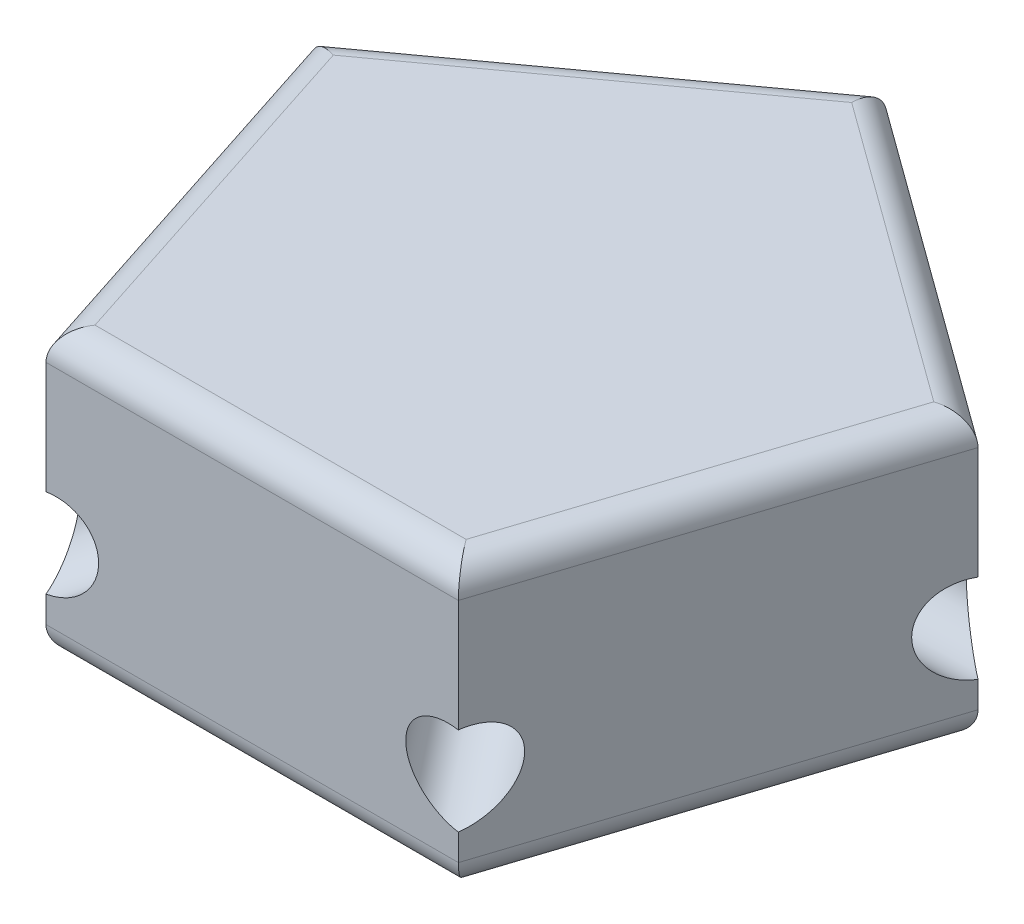
ISO-10303-21;
HEADER;
FILE_DESCRIPTION(('STEP AP214'),'2;1');
FILE_NAME('part.step','',(''),(''),'','','');
FILE_SCHEMA(('AUTOMOTIVE_DESIGN { 1 0 10303 214 1 1 1 1 }'));
ENDSEC;
DATA;
#1=APPLICATION_CONTEXT('core data for automotive mechanical design processes');
#2=APPLICATION_PROTOCOL_DEFINITION('international standard','automotive_design',2000,#1);
#3=PRODUCT_CONTEXT('',#1,'mechanical');
#4=PRODUCT('Part','Part','',(#3));
#5=PRODUCT_RELATED_PRODUCT_CATEGORY('part','',(#4));
#6=PRODUCT_DEFINITION_FORMATION('','',#4);
#7=PRODUCT_DEFINITION_CONTEXT('part definition',#1,'design');
#8=PRODUCT_DEFINITION('design','',#6,#7);
#9=PRODUCT_DEFINITION_SHAPE('','',#8);
#10=(LENGTH_UNIT() NAMED_UNIT(*) SI_UNIT(.MILLI.,.METRE.));
#11=(NAMED_UNIT(*) PLANE_ANGLE_UNIT() SI_UNIT($,.RADIAN.));
#12=(NAMED_UNIT(*) SI_UNIT($,.STERADIAN.) SOLID_ANGLE_UNIT());
#13=UNCERTAINTY_MEASURE_WITH_UNIT(LENGTH_MEASURE(1.E-05),#10,'distance_accuracy_value','');
#14=(GEOMETRIC_REPRESENTATION_CONTEXT(3) GLOBAL_UNCERTAINTY_ASSIGNED_CONTEXT((#13)) GLOBAL_UNIT_ASSIGNED_CONTEXT((#10,
#11,#12)) REPRESENTATION_CONTEXT('',''));
#15=CARTESIAN_POINT('',(0.,0.,0.));
#16=DIRECTION('',(0.,0.,1.));
#17=DIRECTION('',(1.,0.,0.));
#18=AXIS2_PLACEMENT_3D('',#15,#16,#17);
#19=CARTESIAN_POINT('',(-11.7557050458495,-7.,-3.81966011250105));
#20=DIRECTION('',(-0.951056516295154,0.,0.309016994374947));
#21=DIRECTION('',(0.309016994374947,0.,0.951056516295154));
#22=AXIS2_PLACEMENT_3D('',#19,#20,#21);
#23=PLANE('',#22);
#24=CARTESIAN_POINT('',(-11.7557050458491,-3.51141009169856,-3.81966011249993));
#25=DIRECTION('',(-0.951056516295154,0.,0.309016994374947));
#26=DIRECTION('',(0.278226309960892,0.435147350957825,0.856292533775656));
#27=AXIS2_PLACEMENT_3D('',#24,#25,#26);
#28=ELLIPSE('',#27,1.92746442768023,1.49999999999998);
#29=CARTESIAN_POINT('',(-11.7557050458495,-5.07076156974525,-3.81966011250105));
#30=VERTEX_POINT('',#29);
#31=CARTESIAN_POINT('',(-11.7557050458495,-1.95205861365226,-3.81966011250105));
#32=VERTEX_POINT('',#31);
#33=EDGE_CURVE('E46',#30,#32,#28,.T.);
#34=ORIENTED_EDGE('',*,*,#33,.F.);
#35=DIRECTION('',(0.,1.,0.));
#36=VECTOR('',#35,1.);
#37=CARTESIAN_POINT('',(-11.7557050458495,-7.,-3.81966011250105));
#38=LINE('',#37,#36);
#39=CARTESIAN_POINT('',(-11.7557050458495,-6.,-3.81966011250105));
#40=VERTEX_POINT('',#39);
#41=EDGE_CURVE('E177',#40,#30,#38,.T.);
#42=ORIENTED_EDGE('',*,*,#41,.F.);
#43=DIRECTION('',(0.309016994374947,0.,0.951056516295154));
#44=VECTOR('',#43,1.);
#45=CARTESIAN_POINT('',(-7.26542528005361,-6.,10.));
#46=LINE('',#45,#44);
#47=CARTESIAN_POINT('',(-7.26542528005361,-6.,10.));
#48=VERTEX_POINT('',#47);
#49=EDGE_CURVE('E207',#40,#48,#46,.T.);
#50=ORIENTED_EDGE('',*,*,#49,.T.);
#51=DIRECTION('',(0.,1.,0.));
#52=VECTOR('',#51,1.);
#53=CARTESIAN_POINT('',(-7.26542528005361,-7.,10.));
#54=LINE('',#53,#52);
#55=CARTESIAN_POINT('',(-7.26542528005361,-5.07076156974525,10.));
#56=VERTEX_POINT('',#55);
#57=EDGE_CURVE('E168',#48,#56,#54,.T.);
#58=ORIENTED_EDGE('',*,*,#57,.T.);
#59=CARTESIAN_POINT('',(-7.26542528005323,-3.51141009169896,10.0000000000012));
#60=DIRECTION('',(-0.951056516295154,0.,0.309016994374947));
#61=DIRECTION('',(-0.278226309960893,0.435147350957815,-0.856292533775661));
#62=AXIS2_PLACEMENT_3D('',#59,#60,#61);
#63=ELLIPSE('',#62,1.92746442768026,1.49999999999998);
#64=CARTESIAN_POINT('',(-7.26542528005361,-1.95205861365226,10.));
#65=VERTEX_POINT('',#64);
#66=EDGE_CURVE('E237',#65,#56,#63,.T.);
#67=ORIENTED_EDGE('',*,*,#66,.F.);
#68=CARTESIAN_POINT('',(-7.26542528005361,2.,10.));
#69=VERTEX_POINT('',#68);
#70=EDGE_CURVE('E173',#65,#69,#54,.T.);
#71=ORIENTED_EDGE('',*,*,#70,.T.);
#72=DIRECTION('',(0.309016994374947,0.,0.951056516295154));
#73=VECTOR('',#72,1.);
#74=CARTESIAN_POINT('',(-11.7557050458495,2.,-3.81966011250105));
#75=LINE('',#74,#73);
#76=CARTESIAN_POINT('',(-11.7557050458495,2.,-3.81966011250105));
#77=VERTEX_POINT('',#76);
#78=EDGE_CURVE('E204',#69,#77,#75,.F.);
#79=ORIENTED_EDGE('',*,*,#78,.T.);
#80=EDGE_CURVE('E264',#32,#77,#38,.T.);
#81=ORIENTED_EDGE('',*,*,#80,.F.);
#82=EDGE_LOOP('',(#34,#42,#50,#58,#67,#71,#79,#81));
#83=FACE_BOUND('',#82,.T.);
#84=ADVANCED_FACE('F33',(#83),#23,.T.);
#85=CARTESIAN_POINT('',(0.,-7.,-12.3606797749979));
#86=DIRECTION('',(-0.587785252292473,0.,-0.809016994374947));
#87=DIRECTION('',(-0.809016994374947,0.,0.587785252292473));
#88=AXIS2_PLACEMENT_3D('',#85,#86,#87);
#89=PLANE('',#88);
#90=CARTESIAN_POINT('',(-11.7557050458504,-3.51141009169895,-3.81966011250036));
#91=DIRECTION('',(-0.587785252292473,0.,-0.809016994374947));
#92=DIRECTION('',(0.728405936042082,0.435147350957816,-0.529217890186125));
#93=AXIS2_PLACEMENT_3D('',#90,#91,#92);
#94=ELLIPSE('',#93,1.92746442768025,1.49999999999998);
#95=EDGE_CURVE('E11',#32,#30,#94,.T.);
#96=ORIENTED_EDGE('',*,*,#95,.F.);
#97=ORIENTED_EDGE('',*,*,#80,.T.);
#98=DIRECTION('',(-0.809016994374947,0.,0.587785252292473));
#99=VECTOR('',#98,1.);
#100=CARTESIAN_POINT('',(0.,2.,-12.3606797749979));
#101=LINE('',#100,#99);
#102=CARTESIAN_POINT('',(0.,2.,-12.3606797749979));
#103=VERTEX_POINT('',#102);
#104=EDGE_CURVE('E199',#77,#103,#101,.F.);
#105=ORIENTED_EDGE('',*,*,#104,.T.);
#106=DIRECTION('',(0.,1.,0.));
#107=VECTOR('',#106,1.);
#108=CARTESIAN_POINT('',(0.,-7.,-12.3606797749979));
#109=LINE('',#108,#107);
#110=CARTESIAN_POINT('',(0.,-1.95205861365226,-12.3606797749979));
#111=VERTEX_POINT('',#110);
#112=EDGE_CURVE('E259',#111,#103,#109,.T.);
#113=ORIENTED_EDGE('',*,*,#112,.F.);
#114=CARTESIAN_POINT('',(-9.16789166848286E-13,-3.51141009169856,-12.3606797749972));
#115=DIRECTION('',(-0.587785252292473,0.,-0.809016994374947));
#116=DIRECTION('',(-0.728405936042079,0.435147350957823,0.529217890186123));
#117=AXIS2_PLACEMENT_3D('',#114,#115,#116);
#118=ELLIPSE('',#117,1.92746442768023,1.49999999999998);
#119=CARTESIAN_POINT('',(0.,-5.07076156974525,-12.3606797749979));
#120=VERTEX_POINT('',#119);
#121=EDGE_CURVE('E53',#120,#111,#118,.T.);
#122=ORIENTED_EDGE('',*,*,#121,.F.);
#123=CARTESIAN_POINT('',(0.,-6.,-12.3606797749979));
#124=VERTEX_POINT('',#123);
#125=EDGE_CURVE('E257',#124,#120,#109,.T.);
#126=ORIENTED_EDGE('',*,*,#125,.F.);
#127=DIRECTION('',(-0.809016994374947,0.,0.587785252292473));
#128=VECTOR('',#127,1.);
#129=CARTESIAN_POINT('',(-11.7557050458495,-6.,-3.81966011250105));
#130=LINE('',#129,#128);
#131=EDGE_CURVE('E202',#124,#40,#130,.T.);
#132=ORIENTED_EDGE('',*,*,#131,.T.);
#133=ORIENTED_EDGE('',*,*,#41,.T.);
#134=EDGE_LOOP('',(#96,#97,#105,#113,#122,#126,#132,#133));
#135=FACE_BOUND('',#134,.T.);
#136=ADVANCED_FACE('F256',(#135),#89,.T.);
#137=CARTESIAN_POINT('',(11.7557050458495,-7.,-3.81966011250106));
#138=DIRECTION('',(0.587785252292473,0.,-0.809016994374947));
#139=DIRECTION('',(-0.809016994374948,0.,-0.587785252292473));
#140=AXIS2_PLACEMENT_3D('',#137,#138,#139);
#141=PLANE('',#140);
#142=CARTESIAN_POINT('',(-9.16789166848295E-13,-3.51141009169894,-12.3606797749986));
#143=DIRECTION('',(0.587785252292473,0.,-0.809016994374947));
#144=DIRECTION('',(0.728405936042081,0.435147350957817,0.529217890186125));
#145=AXIS2_PLACEMENT_3D('',#142,#143,#144);
#146=ELLIPSE('',#145,1.92746442768025,1.49999999999998);
#147=EDGE_CURVE('E41',#111,#120,#146,.T.);
#148=ORIENTED_EDGE('',*,*,#147,.F.);
#149=ORIENTED_EDGE('',*,*,#112,.T.);
#150=DIRECTION('',(-0.809016994374948,0.,-0.587785252292473));
#151=VECTOR('',#150,1.);
#152=CARTESIAN_POINT('',(11.7557050458495,2.,-3.81966011250106));
#153=LINE('',#152,#151);
#154=CARTESIAN_POINT('',(11.7557050458495,2.,-3.81966011250106));
#155=VERTEX_POINT('',#154);
#156=EDGE_CURVE('E194',#103,#155,#153,.F.);
#157=ORIENTED_EDGE('',*,*,#156,.T.);
#158=DIRECTION('',(0.,1.,0.));
#159=VECTOR('',#158,1.);
#160=CARTESIAN_POINT('',(11.7557050458495,-7.,-3.81966011250106));
#161=LINE('',#160,#159);
#162=CARTESIAN_POINT('',(11.7557050458495,-1.95205861365226,-3.81966011250106));
#163=VERTEX_POINT('',#162);
#164=EDGE_CURVE('E164',#163,#155,#161,.T.);
#165=ORIENTED_EDGE('',*,*,#164,.F.);
#166=CARTESIAN_POINT('',(11.7557050458486,-3.51141009169858,-3.81966011250169));
#167=DIRECTION('',(0.587785252292473,0.,-0.809016994374947));
#168=DIRECTION('',(-0.72840593604208,0.435147350957822,-0.529217890186124));
#169=AXIS2_PLACEMENT_3D('',#166,#167,#168);
#170=ELLIPSE('',#169,1.92746442768024,1.49999999999998);
#171=CARTESIAN_POINT('',(11.7557050458495,-5.07076156974525,-3.81966011250106));
#172=VERTEX_POINT('',#171);
#173=EDGE_CURVE('E156',#172,#163,#170,.T.);
#174=ORIENTED_EDGE('',*,*,#173,.F.);
#175=CARTESIAN_POINT('',(11.7557050458495,-6.,-3.81966011250106));
#176=VERTEX_POINT('',#175);
#177=EDGE_CURVE('E166',#176,#172,#161,.T.);
#178=ORIENTED_EDGE('',*,*,#177,.F.);
#179=DIRECTION('',(-0.809016994374948,0.,-0.587785252292473));
#180=VECTOR('',#179,1.);
#181=CARTESIAN_POINT('',(0.,-6.,-12.3606797749979));
#182=LINE('',#181,#180);
#183=EDGE_CURVE('E197',#176,#124,#182,.T.);
#184=ORIENTED_EDGE('',*,*,#183,.T.);
#185=ORIENTED_EDGE('',*,*,#125,.T.);
#186=EDGE_LOOP('',(#148,#149,#157,#165,#174,#178,#184,#185));
#187=FACE_BOUND('',#186,.T.);
#188=ADVANCED_FACE('F261',(#187),#141,.T.);
#189=CARTESIAN_POINT('',(7.26542528005361,-7.,10.));
#190=DIRECTION('',(0.951056516295154,0.,0.309016994374947));
#191=DIRECTION('',(0.309016994374948,0.,-0.951056516295154));
#192=AXIS2_PLACEMENT_3D('',#189,#190,#191);
#193=PLANE('',#192);
#194=CARTESIAN_POINT('',(11.7557050458498,-3.51141009169894,-3.81966011250208));
#195=DIRECTION('',(0.951056516295154,0.,0.309016994374947));
#196=DIRECTION('',(-0.278226309960893,0.435147350957819,0.856292533775659));
#197=AXIS2_PLACEMENT_3D('',#194,#195,#196);
#198=ELLIPSE('',#197,1.92746442768025,1.49999999999998);
#199=EDGE_CURVE('E146',#163,#172,#198,.T.);
#200=ORIENTED_EDGE('',*,*,#199,.F.);
#201=ORIENTED_EDGE('',*,*,#164,.T.);
#202=DIRECTION('',(0.309016994374948,0.,-0.951056516295154));
#203=VECTOR('',#202,1.);
#204=CARTESIAN_POINT('',(7.26542528005361,2.,10.));
#205=LINE('',#204,#203);
#206=CARTESIAN_POINT('',(7.26542528005361,2.,10.));
#207=VERTEX_POINT('',#206);
#208=EDGE_CURVE('E190',#155,#207,#205,.F.);
#209=ORIENTED_EDGE('',*,*,#208,.T.);
#210=DIRECTION('',(0.,1.,0.));
#211=VECTOR('',#210,1.);
#212=CARTESIAN_POINT('',(7.26542528005361,-7.,10.));
#213=LINE('',#212,#211);
#214=CARTESIAN_POINT('',(7.26542528005361,-1.95205861365226,10.));
#215=VERTEX_POINT('',#214);
#216=EDGE_CURVE('E155',#215,#207,#213,.T.);
#217=ORIENTED_EDGE('',*,*,#216,.F.);
#218=CARTESIAN_POINT('',(7.26542528005393,-3.51141009169858,9.99999999999901));
#219=DIRECTION('',(0.951056516295154,0.,0.309016994374947));
#220=DIRECTION('',(0.278226309960893,0.435147350957821,-0.856292533775658));
#221=AXIS2_PLACEMENT_3D('',#218,#219,#220);
#222=ELLIPSE('',#221,1.92746442768024,1.49999999999998);
#223=CARTESIAN_POINT('',(7.26542528005361,-5.07076156974525,10.));
#224=VERTEX_POINT('',#223);
#225=EDGE_CURVE('E142',#224,#215,#222,.T.);
#226=ORIENTED_EDGE('',*,*,#225,.F.);
#227=CARTESIAN_POINT('',(7.26542528005361,-6.,10.));
#228=VERTEX_POINT('',#227);
#229=EDGE_CURVE('E153',#228,#224,#213,.T.);
#230=ORIENTED_EDGE('',*,*,#229,.F.);
#231=DIRECTION('',(0.309016994374948,0.,-0.951056516295154));
#232=VECTOR('',#231,1.);
#233=CARTESIAN_POINT('',(11.7557050458495,-6.,-3.81966011250106));
#234=LINE('',#233,#232);
#235=EDGE_CURVE('E192',#228,#176,#234,.T.);
#236=ORIENTED_EDGE('',*,*,#235,.T.);
#237=ORIENTED_EDGE('',*,*,#177,.T.);
#238=EDGE_LOOP('',(#200,#201,#209,#217,#226,#230,#236,#237));
#239=FACE_BOUND('',#238,.T.);
#240=ADVANCED_FACE('F152',(#239),#193,.T.);
#241=CARTESIAN_POINT('',(-7.26542528005361,-7.,10.));
#242=DIRECTION('',(0.,0.,1.));
#243=DIRECTION('',(1.,0.,0.));
#244=AXIS2_PLACEMENT_3D('',#241,#242,#243);
#245=PLANE('',#244);
#246=CARTESIAN_POINT('',(7.26542528005466,-3.51141009169893,10.));
#247=DIRECTION('',(0.,0.,1.));
#248=DIRECTION('',(-0.900359252162375,0.43514735095782,0.));
#249=AXIS2_PLACEMENT_3D('',#246,#247,#248);
#250=ELLIPSE('',#249,1.92746442768024,1.49999999999998);
#251=EDGE_CURVE('E138',#215,#224,#250,.T.);
#252=ORIENTED_EDGE('',*,*,#251,.F.);
#253=ORIENTED_EDGE('',*,*,#216,.T.);
#254=DIRECTION('',(1.,0.,0.));
#255=VECTOR('',#254,1.);
#256=CARTESIAN_POINT('',(-7.26542528005361,2.,10.));
#257=LINE('',#256,#255);
#258=EDGE_CURVE('E174',#207,#69,#257,.F.);
#259=ORIENTED_EDGE('',*,*,#258,.T.);
#260=ORIENTED_EDGE('',*,*,#70,.F.);
#261=CARTESIAN_POINT('',(-7.26542528005239,-3.51141009169855,10.));
#262=DIRECTION('',(0.,0.,1.));
#263=DIRECTION('',(0.900359252162372,0.435147350957826,0.));
#264=AXIS2_PLACEMENT_3D('',#261,#262,#263);
#265=ELLIPSE('',#264,1.92746442768022,1.49999999999998);
#266=EDGE_CURVE('E147',#56,#65,#265,.T.);
#267=ORIENTED_EDGE('',*,*,#266,.F.);
#268=ORIENTED_EDGE('',*,*,#57,.F.);
#269=DIRECTION('',(1.,0.,0.));
#270=VECTOR('',#269,1.);
#271=CARTESIAN_POINT('',(7.26542528005361,-6.,10.));
#272=LINE('',#271,#270);
#273=EDGE_CURVE('E163',#48,#228,#272,.T.);
#274=ORIENTED_EDGE('',*,*,#273,.T.);
#275=ORIENTED_EDGE('',*,*,#229,.T.);
#276=EDGE_LOOP('',(#252,#253,#259,#260,#267,#268,#274,#275));
#277=FACE_BOUND('',#276,.T.);
#278=ADVANCED_FACE('F160',(#277),#245,.T.);
#279=CARTESIAN_POINT('',(0.,-7.,0.));
#280=DIRECTION('',(0.,1.,0.));
#281=DIRECTION('',(0.,0.,1.));
#282=AXIS2_PLACEMENT_3D('',#279,#280,#281);
#283=PLANE('',#282);
#284=DIRECTION('',(0.309016994374948,0.,-0.951056516295154));
#285=VECTOR('',#284,1.);
#286=CARTESIAN_POINT('',(6.31436876375846,-7.,9.69098300562505));
#287=LINE('',#286,#285);
#288=CARTESIAN_POINT('',(10.5801345412645,-7.,-3.43769410125095));
#289=VERTEX_POINT('',#288);
#290=CARTESIAN_POINT('',(6.53888275204825,-7.,9.));
#291=VERTEX_POINT('',#290);
#292=EDGE_CURVE('E185',#289,#291,#287,.F.);
#293=ORIENTED_EDGE('',*,*,#292,.T.);
#294=DIRECTION('',(1.,0.,0.));
#295=VECTOR('',#294,1.);
#296=CARTESIAN_POINT('',(-7.26542528005361,-7.,9.));
#297=LINE('',#296,#295);
#298=CARTESIAN_POINT('',(-6.53888275204825,-7.,9.));
#299=VERTEX_POINT('',#298);
#300=EDGE_CURVE('E187',#291,#299,#297,.F.);
#301=ORIENTED_EDGE('',*,*,#300,.T.);
#302=DIRECTION('',(0.309016994374947,0.,0.951056516295154));
#303=VECTOR('',#302,1.);
#304=CARTESIAN_POINT('',(-10.8046485295543,-7.,-4.128677106876));
#305=LINE('',#304,#303);
#306=CARTESIAN_POINT('',(-10.5801345412645,-7.,-3.43769410125095));
#307=VERTEX_POINT('',#306);
#308=EDGE_CURVE('E179',#299,#307,#305,.F.);
#309=ORIENTED_EDGE('',*,*,#308,.T.);
#310=DIRECTION('',(-0.809016994374947,0.,0.587785252292473));
#311=VECTOR('',#310,1.);
#312=CARTESIAN_POINT('',(0.587785252292473,-7.,-11.551662780623));
#313=LINE('',#312,#311);
#314=CARTESIAN_POINT('',(0.,-7.,-11.1246117974981));
#315=VERTEX_POINT('',#314);
#316=EDGE_CURVE('E181',#307,#315,#313,.F.);
#317=ORIENTED_EDGE('',*,*,#316,.T.);
#318=DIRECTION('',(-0.809016994374948,0.,-0.587785252292473));
#319=VECTOR('',#318,1.);
#320=CARTESIAN_POINT('',(11.167919793557,-7.,-3.01064311812611));
#321=LINE('',#320,#319);
#322=EDGE_CURVE('E183',#315,#289,#321,.F.);
#323=ORIENTED_EDGE('',*,*,#322,.T.);
#324=EDGE_LOOP('',(#293,#301,#309,#317,#323));
#325=FACE_BOUND('',#324,.T.);
#326=ADVANCED_FACE('F383',(#325),#283,.F.);
#327=CARTESIAN_POINT('',(0.,3.,0.));
#328=DIRECTION('',(0.,1.,0.));
#329=DIRECTION('',(0.,0.,1.));
#330=AXIS2_PLACEMENT_3D('',#327,#328,#329);
#331=PLANE('',#330);
#332=DIRECTION('',(-0.809016994374948,0.,-0.587785252292473));
#333=VECTOR('',#332,1.);
#334=CARTESIAN_POINT('',(5.29006727063226,3.,-7.28115294937453));
#335=LINE('',#334,#333);
#336=CARTESIAN_POINT('',(10.5801345412645,3.,-3.43769410125095));
#337=VERTEX_POINT('',#336);
#338=CARTESIAN_POINT('',(0.,3.,-11.1246117974981));
#339=VERTEX_POINT('',#338);
#340=EDGE_CURVE('E215',#337,#339,#335,.T.);
#341=ORIENTED_EDGE('',*,*,#340,.T.);
#342=DIRECTION('',(-0.809016994374947,0.,0.587785252292473));
#343=VECTOR('',#342,1.);
#344=CARTESIAN_POINT('',(-5.29006727063226,3.,-7.28115294937453));
#345=LINE('',#344,#343);
#346=CARTESIAN_POINT('',(-10.5801345412645,3.,-3.43769410125095));
#347=VERTEX_POINT('',#346);
#348=EDGE_CURVE('E217',#339,#347,#345,.T.);
#349=ORIENTED_EDGE('',*,*,#348,.T.);
#350=DIRECTION('',(0.309016994374947,0.,0.951056516295154));
#351=VECTOR('',#350,1.);
#352=CARTESIAN_POINT('',(-8.55950864665638,3.,2.78115294937453));
#353=LINE('',#352,#351);
#354=CARTESIAN_POINT('',(-6.53888275204825,3.,9.));
#355=VERTEX_POINT('',#354);
#356=EDGE_CURVE('E209',#347,#355,#353,.T.);
#357=ORIENTED_EDGE('',*,*,#356,.T.);
#358=DIRECTION('',(1.,0.,0.));
#359=VECTOR('',#358,1.);
#360=CARTESIAN_POINT('',(0.,3.,9.));
#361=LINE('',#360,#359);
#362=CARTESIAN_POINT('',(6.53888275204825,3.,9.));
#363=VERTEX_POINT('',#362);
#364=EDGE_CURVE('E211',#355,#363,#361,.T.);
#365=ORIENTED_EDGE('',*,*,#364,.T.);
#366=DIRECTION('',(0.309016994374948,0.,-0.951056516295154));
#367=VECTOR('',#366,1.);
#368=CARTESIAN_POINT('',(8.55950864665638,3.,2.78115294937453));
#369=LINE('',#368,#367);
#370=EDGE_CURVE('E213',#363,#337,#369,.T.);
#371=ORIENTED_EDGE('',*,*,#370,.T.);
#372=EDGE_LOOP('',(#341,#349,#357,#365,#371));
#373=FACE_BOUND('',#372,.T.);
#374=ADVANCED_FACE('F326',(#373),#331,.T.);
#375=CARTESIAN_POINT('',(0.587785252292473,-6.,-11.551662780623));
#376=DIRECTION('',(0.809016994374947,0.,-0.587785252292473));
#377=DIRECTION('',(-0.587785252292473,0.,-0.809016994374947));
#378=AXIS2_PLACEMENT_3D('',#375,#376,#377);
#379=CYLINDRICAL_SURFACE('',#378,1.);
#380=CARTESIAN_POINT('',(-10.5801345412645,-6.,-3.43769410125094));
#381=DIRECTION('',(0.309016994374947,0.,-0.951056516295154));
#382=DIRECTION('',(-0.951056516295153,0.,-0.309016994374947));
#383=AXIS2_PLACEMENT_3D('',#380,#381,#382);
#384=ELLIPSE('',#383,1.23606797749979,1.);
#385=EDGE_CURVE('E228',#40,#307,#384,.F.);
#386=ORIENTED_EDGE('',*,*,#385,.F.);
#387=ORIENTED_EDGE('',*,*,#131,.F.);
#388=CARTESIAN_POINT('',(0.,-6.,-11.1246117974981));
#389=DIRECTION('',(1.,0.,0.));
#390=DIRECTION('',(0.,0.,-1.));
#391=AXIS2_PLACEMENT_3D('',#388,#389,#390);
#392=ELLIPSE('',#391,1.23606797749979,1.);
#393=EDGE_CURVE('E231',#315,#124,#392,.T.);
#394=ORIENTED_EDGE('',*,*,#393,.F.);
#395=ORIENTED_EDGE('',*,*,#316,.F.);
#396=EDGE_LOOP('',(#386,#387,#394,#395));
#397=FACE_BOUND('',#396,.T.);
#398=ADVANCED_FACE('F322',(#397),#379,.T.);
#399=CARTESIAN_POINT('',(11.167919793557,-6.,-3.01064311812611));
#400=DIRECTION('',(0.809016994374948,0.,0.587785252292473));
#401=DIRECTION('',(0.587785252292473,0.,-0.809016994374947));
#402=AXIS2_PLACEMENT_3D('',#399,#400,#401);
#403=CYLINDRICAL_SURFACE('',#402,1.);
#404=ORIENTED_EDGE('',*,*,#393,.T.);
#405=ORIENTED_EDGE('',*,*,#183,.F.);
#406=CARTESIAN_POINT('',(10.5801345412645,-6.,-3.43769410125095));
#407=DIRECTION('',(0.309016994374948,0.,0.951056516295154));
#408=DIRECTION('',(0.951056516295153,0.,-0.309016994374947));
#409=AXIS2_PLACEMENT_3D('',#406,#407,#408);
#410=ELLIPSE('',#409,1.23606797749979,1.);
#411=EDGE_CURVE('E225',#289,#176,#410,.T.);
#412=ORIENTED_EDGE('',*,*,#411,.F.);
#413=ORIENTED_EDGE('',*,*,#322,.F.);
#414=EDGE_LOOP('',(#404,#405,#412,#413));
#415=FACE_BOUND('',#414,.T.);
#416=ADVANCED_FACE('F318',(#415),#403,.T.);
#417=CARTESIAN_POINT('',(-10.8046485295543,-6.,-4.128677106876));
#418=DIRECTION('',(-0.309016994374947,0.,-0.951056516295154));
#419=DIRECTION('',(-0.951056516295154,0.,0.309016994374947));
#420=AXIS2_PLACEMENT_3D('',#417,#418,#419);
#421=CYLINDRICAL_SURFACE('',#420,1.);
#422=ORIENTED_EDGE('',*,*,#385,.T.);
#423=ORIENTED_EDGE('',*,*,#308,.F.);
#424=CARTESIAN_POINT('',(-6.53888275204825,-6.,9.));
#425=DIRECTION('',(-0.809016994374947,0.,-0.587785252292473));
#426=DIRECTION('',(0.587785252292473,0.,-0.809016994374947));
#427=AXIS2_PLACEMENT_3D('',#424,#425,#426);
#428=ELLIPSE('',#427,1.23606797749979,1.);
#429=EDGE_CURVE('E222',#48,#299,#428,.F.);
#430=ORIENTED_EDGE('',*,*,#429,.F.);
#431=ORIENTED_EDGE('',*,*,#49,.F.);
#432=EDGE_LOOP('',(#422,#423,#430,#431));
#433=FACE_BOUND('',#432,.T.);
#434=ADVANCED_FACE('F314',(#433),#421,.T.);
#435=CARTESIAN_POINT('',(6.31436876375846,-6.,9.69098300562505));
#436=DIRECTION('',(-0.309016994374948,0.,0.951056516295154));
#437=DIRECTION('',(0.951056516295154,0.,0.309016994374947));
#438=AXIS2_PLACEMENT_3D('',#435,#436,#437);
#439=CYLINDRICAL_SURFACE('',#438,1.);
#440=ORIENTED_EDGE('',*,*,#411,.T.);
#441=ORIENTED_EDGE('',*,*,#235,.F.);
#442=CARTESIAN_POINT('',(6.53888275204825,-6.,9.));
#443=DIRECTION('',(-0.809016994374947,0.,0.587785252292473));
#444=DIRECTION('',(0.587785252292473,0.,0.809016994374948));
#445=AXIS2_PLACEMENT_3D('',#442,#443,#444);
#446=ELLIPSE('',#445,1.23606797749979,1.);
#447=EDGE_CURVE('E220',#291,#228,#446,.T.);
#448=ORIENTED_EDGE('',*,*,#447,.F.);
#449=ORIENTED_EDGE('',*,*,#292,.F.);
#450=EDGE_LOOP('',(#440,#441,#448,#449));
#451=FACE_BOUND('',#450,.T.);
#452=ADVANCED_FACE('F310',(#451),#439,.T.);
#453=CARTESIAN_POINT('',(-7.26542528005361,-6.,9.));
#454=DIRECTION('',(-1.,0.,0.));
#455=DIRECTION('',(0.,0.,1.));
#456=AXIS2_PLACEMENT_3D('',#453,#454,#455);
#457=CYLINDRICAL_SURFACE('',#456,1.);
#458=ORIENTED_EDGE('',*,*,#429,.T.);
#459=ORIENTED_EDGE('',*,*,#300,.F.);
#460=ORIENTED_EDGE('',*,*,#447,.T.);
#461=ORIENTED_EDGE('',*,*,#273,.F.);
#462=EDGE_LOOP('',(#458,#459,#460,#461));
#463=FACE_BOUND('',#462,.T.);
#464=ADVANCED_FACE('F307',(#463),#457,.T.);
#465=CARTESIAN_POINT('',(8.55950864665638,2.,2.78115294937453));
#466=DIRECTION('',(0.309016994374948,0.,-0.951056516295154));
#467=DIRECTION('',(-0.951056516295154,0.,-0.309016994374947));
#468=AXIS2_PLACEMENT_3D('',#465,#466,#467);
#469=CYLINDRICAL_SURFACE('',#468,1.);
#470=CARTESIAN_POINT('',(10.5801345412645,2.,-3.43769410125095));
#471=DIRECTION('',(-0.309016994374948,0.,-0.951056516295154));
#472=DIRECTION('',(0.951056516295153,0.,-0.309016994374947));
#473=AXIS2_PLACEMENT_3D('',#470,#471,#472);
#474=ELLIPSE('',#473,1.23606797749979,1.);
#475=EDGE_CURVE('E243',#337,#155,#474,.T.);
#476=ORIENTED_EDGE('',*,*,#475,.F.);
#477=ORIENTED_EDGE('',*,*,#370,.F.);
#478=CARTESIAN_POINT('',(6.53888275204825,2.,9.));
#479=DIRECTION('',(0.809016994374947,0.,-0.587785252292473));
#480=DIRECTION('',(0.587785252292473,0.,0.809016994374948));
#481=AXIS2_PLACEMENT_3D('',#478,#479,#480);
#482=ELLIPSE('',#481,1.23606797749979,1.);
#483=EDGE_CURVE('E223',#207,#363,#482,.F.);
#484=ORIENTED_EDGE('',*,*,#483,.F.);
#485=ORIENTED_EDGE('',*,*,#208,.F.);
#486=EDGE_LOOP('',(#476,#477,#484,#485));
#487=FACE_BOUND('',#486,.T.);
#488=ADVANCED_FACE('F35',(#487),#469,.T.);
#489=CARTESIAN_POINT('',(0.,2.,9.));
#490=DIRECTION('',(1.,0.,0.));
#491=DIRECTION('',(0.,0.,-1.));
#492=AXIS2_PLACEMENT_3D('',#489,#490,#491);
#493=CYLINDRICAL_SURFACE('',#492,1.);
#494=ORIENTED_EDGE('',*,*,#483,.T.);
#495=ORIENTED_EDGE('',*,*,#364,.F.);
#496=CARTESIAN_POINT('',(-6.53888275204825,2.,9.));
#497=DIRECTION('',(0.809016994374947,0.,0.587785252292473));
#498=DIRECTION('',(-0.587785252292473,0.,0.809016994374947));
#499=AXIS2_PLACEMENT_3D('',#496,#497,#498);
#500=ELLIPSE('',#499,1.23606797749979,1.);
#501=EDGE_CURVE('E240',#69,#355,#500,.F.);
#502=ORIENTED_EDGE('',*,*,#501,.F.);
#503=ORIENTED_EDGE('',*,*,#258,.F.);
#504=EDGE_LOOP('',(#494,#495,#502,#503));
#505=FACE_BOUND('',#504,.T.);
#506=ADVANCED_FACE('F339',(#505),#493,.T.);
#507=CARTESIAN_POINT('',(5.29006727063226,2.,-7.28115294937453));
#508=DIRECTION('',(-0.809016994374948,0.,-0.587785252292473));
#509=DIRECTION('',(-0.587785252292473,0.,0.809016994374947));
#510=AXIS2_PLACEMENT_3D('',#507,#508,#509);
#511=CYLINDRICAL_SURFACE('',#510,1.);
#512=ORIENTED_EDGE('',*,*,#475,.T.);
#513=ORIENTED_EDGE('',*,*,#156,.F.);
#514=CARTESIAN_POINT('',(0.,2.,-11.1246117974981));
#515=DIRECTION('',(-1.,0.,0.));
#516=DIRECTION('',(0.,0.,-1.));
#517=AXIS2_PLACEMENT_3D('',#514,#515,#516);
#518=ELLIPSE('',#517,1.23606797749979,1.);
#519=EDGE_CURVE('E236',#339,#103,#518,.T.);
#520=ORIENTED_EDGE('',*,*,#519,.F.);
#521=ORIENTED_EDGE('',*,*,#340,.F.);
#522=EDGE_LOOP('',(#512,#513,#520,#521));
#523=FACE_BOUND('',#522,.T.);
#524=ADVANCED_FACE('F336',(#523),#511,.T.);
#525=CARTESIAN_POINT('',(-8.55950864665638,2.,2.78115294937453));
#526=DIRECTION('',(0.309016994374947,0.,0.951056516295154));
#527=DIRECTION('',(0.951056516295154,0.,-0.309016994374947));
#528=AXIS2_PLACEMENT_3D('',#525,#526,#527);
#529=CYLINDRICAL_SURFACE('',#528,1.);
#530=ORIENTED_EDGE('',*,*,#501,.T.);
#531=ORIENTED_EDGE('',*,*,#356,.F.);
#532=CARTESIAN_POINT('',(-10.5801345412645,2.,-3.43769410125095));
#533=DIRECTION('',(-0.309016994374947,0.,0.951056516295154));
#534=DIRECTION('',(0.951056516295153,0.,0.309016994374947));
#535=AXIS2_PLACEMENT_3D('',#532,#533,#534);
#536=ELLIPSE('',#535,1.23606797749979,1.);
#537=EDGE_CURVE('E234',#77,#347,#536,.F.);
#538=ORIENTED_EDGE('',*,*,#537,.F.);
#539=ORIENTED_EDGE('',*,*,#78,.F.);
#540=EDGE_LOOP('',(#530,#531,#538,#539));
#541=FACE_BOUND('',#540,.T.);
#542=ADVANCED_FACE('F332',(#541),#529,.T.);
#543=CARTESIAN_POINT('',(-5.29006727063226,2.,-7.28115294937453));
#544=DIRECTION('',(-0.809016994374947,0.,0.587785252292473));
#545=DIRECTION('',(0.587785252292473,0.,0.809016994374947));
#546=AXIS2_PLACEMENT_3D('',#543,#544,#545);
#547=CYLINDRICAL_SURFACE('',#546,1.);
#548=ORIENTED_EDGE('',*,*,#519,.T.);
#549=ORIENTED_EDGE('',*,*,#104,.F.);
#550=ORIENTED_EDGE('',*,*,#537,.T.);
#551=ORIENTED_EDGE('',*,*,#348,.F.);
#552=EDGE_LOOP('',(#548,#549,#550,#551));
#553=FACE_BOUND('',#552,.T.);
#554=ADVANCED_FACE('F328',(#553),#547,.T.);
#555=CARTESIAN_POINT('',(-9.23994887250503,-4.46570551166114,12.7176985741957));
#556=DIRECTION('',(0.56541318031982,0.27326652891266,-0.778224478988327));
#557=DIRECTION('',(-0.809016994374955,0.,-0.587785252292463));
#558=AXIS2_PLACEMENT_3D('',#555,#556,#557);
#559=CYLINDRICAL_SURFACE('',#558,1.49999999999998);
#560=ORIENTED_EDGE('',*,*,#66,.T.);
#561=ORIENTED_EDGE('',*,*,#266,.T.);
#562=EDGE_LOOP('',(#560,#561));
#563=FACE_BOUND('',#562,.T.);
#564=CARTESIAN_POINT('',(-2.26165272127819,-1.09306611565044,3.11289791595323));
#565=DIRECTION('',(0.56541318031982,0.27326652891266,-0.778224478988327));
#566=DIRECTION('',(-0.809016994374954,0.,-0.587785252292463));
#567=AXIS2_PLACEMENT_3D('',#564,#565,#566);
#568=CIRCLE('',#567,1.49999999999998);
#569=CARTESIAN_POINT('',(-3.4751782128406,-1.09306611565044,2.23122003751455));
#570=VERTEX_POINT('',#569);
#571=EDGE_CURVE('E269',#570,#570,#568,.T.);
#572=ORIENTED_EDGE('',*,*,#571,.T.);
#573=EDGE_LOOP('',(#572));
#574=FACE_BOUND('',#573,.T.);
#575=ADVANCED_FACE('F331',(#563,#574),#559,.F.);
#576=CARTESIAN_POINT('',(-2.26165272127819,-1.09306611565044,3.11289791595323));
#577=DIRECTION('',(0.56541318031982,0.27326652891266,-0.778224478988327));
#578=DIRECTION('',(-0.809016994374954,0.,-0.587785252292463));
#579=AXIS2_PLACEMENT_3D('',#576,#577,#578);
#580=PLANE('',#579);
#581=ORIENTED_EDGE('',*,*,#571,.F.);
#582=EDGE_LOOP('',(#581));
#583=FACE_BOUND('',#582,.T.);
#584=ADVANCED_FACE('F411',(#583),#580,.F.);
#585=CARTESIAN_POINT('',(9.23994887250657,-4.46570551166115,12.7176985741946));
#586=DIRECTION('',(-0.56541318031983,0.27326652891266,-0.77822447898832));
#587=DIRECTION('',(-0.809016994374947,0.,0.587785252292474));
#588=AXIS2_PLACEMENT_3D('',#585,#586,#587);
#589=CYLINDRICAL_SURFACE('',#588,1.49999999999998);
#590=ORIENTED_EDGE('',*,*,#225,.T.);
#591=ORIENTED_EDGE('',*,*,#251,.T.);
#592=EDGE_LOOP('',(#590,#591));
#593=FACE_BOUND('',#592,.T.);
#594=CARTESIAN_POINT('',(2.26165272127958,-1.09306611565044,3.11289791595222));
#595=DIRECTION('',(-0.56541318031983,0.27326652891266,-0.77822447898832));
#596=DIRECTION('',(-0.809016994374947,0.,0.587785252292474));
#597=AXIS2_PLACEMENT_3D('',#594,#595,#596);
#598=CIRCLE('',#597,1.49999999999998);
#599=CARTESIAN_POINT('',(1.04812722971718,-1.09306611565044,3.99457579439091));
#600=VERTEX_POINT('',#599);
#601=EDGE_CURVE('E274',#600,#600,#598,.T.);
#602=ORIENTED_EDGE('',*,*,#601,.T.);
#603=EDGE_LOOP('',(#602));
#604=FACE_BOUND('',#603,.T.);
#605=ADVANCED_FACE('F140',(#593,#604),#589,.F.);
#606=CARTESIAN_POINT('',(2.26165272127958,-1.09306611565044,3.11289791595222));
#607=DIRECTION('',(-0.56541318031983,0.27326652891266,-0.77822447898832));
#608=DIRECTION('',(-0.809016994374947,0.,0.587785252292474));
#609=AXIS2_PLACEMENT_3D('',#606,#607,#608);
#610=PLANE('',#609);
#611=ORIENTED_EDGE('',*,*,#601,.F.);
#612=EDGE_LOOP('',(#611));
#613=FACE_BOUND('',#612,.T.);
#614=ADVANCED_FACE('F410',(#613),#610,.F.);
#615=CARTESIAN_POINT('',(14.9505513300255,-4.46570551166116,-4.8577285966673));
#616=DIRECTION('',(-0.914857743444656,0.27326652891266,0.297255300096363));
#617=DIRECTION('',(0.30901699437495,0.,0.951056516295153));
#618=AXIS2_PLACEMENT_3D('',#615,#616,#617);
#619=CYLINDRICAL_SURFACE('',#618,1.49999999999998);
#620=ORIENTED_EDGE('',*,*,#173,.T.);
#621=ORIENTED_EDGE('',*,*,#199,.T.);
#622=EDGE_LOOP('',(#620,#621));
#623=FACE_BOUND('',#622,.T.);
#624=CARTESIAN_POINT('',(3.65943097377769,-1.09306611565044,-1.18902120038603));
#625=DIRECTION('',(-0.914857743444656,0.27326652891266,0.297255300096363));
#626=DIRECTION('',(0.30901699437495,0.,0.951056516295153));
#627=AXIS2_PLACEMENT_3D('',#624,#625,#626);
#628=CIRCLE('',#627,1.49999999999998);
#629=CARTESIAN_POINT('',(4.12295646534011,-1.09306611565044,0.237563574056676));
#630=VERTEX_POINT('',#629);
#631=EDGE_CURVE('E277',#630,#630,#628,.T.);
#632=ORIENTED_EDGE('',*,*,#631,.T.);
#633=EDGE_LOOP('',(#632));
#634=FACE_BOUND('',#633,.T.);
#635=ADVANCED_FACE('F422',(#623,#634),#619,.F.);
#636=CARTESIAN_POINT('',(3.65943097377769,-1.09306611565044,-1.18902120038603));
#637=DIRECTION('',(-0.914857743444656,0.27326652891266,0.297255300096363));
#638=DIRECTION('',(0.30901699437495,0.,0.951056516295153));
#639=AXIS2_PLACEMENT_3D('',#636,#637,#638);
#640=PLANE('',#639);
#641=ORIENTED_EDGE('',*,*,#631,.F.);
#642=EDGE_LOOP('',(#641));
#643=FACE_BOUND('',#642,.T.);
#644=ADVANCED_FACE('F432',(#643),#640,.F.);
#645=CARTESIAN_POINT('',(-9.22557403803014E-13,-3.77191913309676,-13.2777099011073));
#646=DIRECTION('',(0.,0.273266528912659,0.961938357783921));
#647=DIRECTION('',(0.,-0.961938357783921,0.273266528912659));
#648=AXIS2_PLACEMENT_3D('',#645,#646,#647);
#649=CYLINDRICAL_SURFACE('',#648,1.49999999999998);
#650=ORIENTED_EDGE('',*,*,#121,.T.);
#651=ORIENTED_EDGE('',*,*,#147,.T.);
#652=EDGE_LOOP('',(#650,#651));
#653=FACE_BOUND('',#652,.T.);
#654=CARTESIAN_POINT('',(-8.63241769732959E-13,-1.09306611565044,-3.84775343113498));
#655=DIRECTION('',(0.,0.27326652891266,0.961938357783921));
#656=DIRECTION('',(1.,0.,0.));
#657=AXIS2_PLACEMENT_3D('',#654,#655,#656);
#658=CIRCLE('',#657,1.49999999999998);
#659=CARTESIAN_POINT('',(1.49999999999911,-1.09306611565044,-3.84775343113499));
#660=VERTEX_POINT('',#659);
#661=EDGE_CURVE('E280',#660,#660,#658,.T.);
#662=ORIENTED_EDGE('',*,*,#661,.T.);
#663=EDGE_LOOP('',(#662));
#664=FACE_BOUND('',#663,.T.);
#665=ADVANCED_FACE('F249',(#653,#664),#649,.F.);
#666=CARTESIAN_POINT('',(-8.63241769732959E-13,-1.09306611565044,-3.84775343113498));
#667=DIRECTION('',(0.,0.27326652891266,0.961938357783921));
#668=DIRECTION('',(1.,0.,0.));
#669=AXIS2_PLACEMENT_3D('',#666,#667,#668);
#670=PLANE('',#669);
#671=ORIENTED_EDGE('',*,*,#661,.F.);
#672=EDGE_LOOP('',(#671));
#673=FACE_BOUND('',#672,.T.);
#674=ADVANCED_FACE('F294',(#673),#670,.F.);
#675=CARTESIAN_POINT('',(-14.950551330026,-4.46570551166113,-4.8577285966655));
#676=DIRECTION('',(0.91485774344466,0.273266528912659,0.297255300096352));
#677=DIRECTION('',(0.309016994374939,0.,-0.951056516295157));
#678=AXIS2_PLACEMENT_3D('',#675,#676,#677);
#679=CYLINDRICAL_SURFACE('',#678,1.49999999999998);
#680=ORIENTED_EDGE('',*,*,#33,.T.);
#681=ORIENTED_EDGE('',*,*,#95,.T.);
#682=EDGE_LOOP('',(#680,#681));
#683=FACE_BOUND('',#682,.T.);
#684=CARTESIAN_POINT('',(-3.65943097377823,-1.09306611565044,-1.18902120038439));
#685=DIRECTION('',(0.91485774344466,0.27326652891266,0.297255300096352));
#686=DIRECTION('',(0.309016994374939,0.,-0.951056516295157));
#687=AXIS2_PLACEMENT_3D('',#684,#685,#686);
#688=CIRCLE('',#687,1.49999999999998);
#689=CARTESIAN_POINT('',(-3.19590548221583,-1.09306611565044,-2.6156059748271));
#690=VERTEX_POINT('',#689);
#691=EDGE_CURVE('E157',#690,#690,#688,.T.);
#692=ORIENTED_EDGE('',*,*,#691,.T.);
#693=EDGE_LOOP('',(#692));
#694=FACE_BOUND('',#693,.T.);
#695=ADVANCED_FACE('F286',(#683,#694),#679,.F.);
#696=CARTESIAN_POINT('',(-3.65943097377823,-1.09306611565044,-1.18902120038439));
#697=DIRECTION('',(0.91485774344466,0.27326652891266,0.297255300096352));
#698=DIRECTION('',(0.309016994374939,0.,-0.951056516295157));
#699=AXIS2_PLACEMENT_3D('',#696,#697,#698);
#700=PLANE('',#699);
#701=ORIENTED_EDGE('',*,*,#691,.F.);
#702=EDGE_LOOP('',(#701));
#703=FACE_BOUND('',#702,.T.);
#704=ADVANCED_FACE('F288',(#703),#700,.F.);
#705=CLOSED_SHELL('',(#84,#136,#188,#240,#278,#326,#374,#398,#416,#434,#452,#464,#488,#506,#524,
#542,#554,#575,#584,#605,#614,#635,#644,#665,#674,#695,#704));
#706=MANIFOLD_SOLID_BREP('B2',#705);
#707=ADVANCED_BREP_SHAPE_REPRESENTATION('',(#18,#706),#14);
#708=SHAPE_DEFINITION_REPRESENTATION(#9,#707);
ENDSEC;
END-ISO-10303-21;
